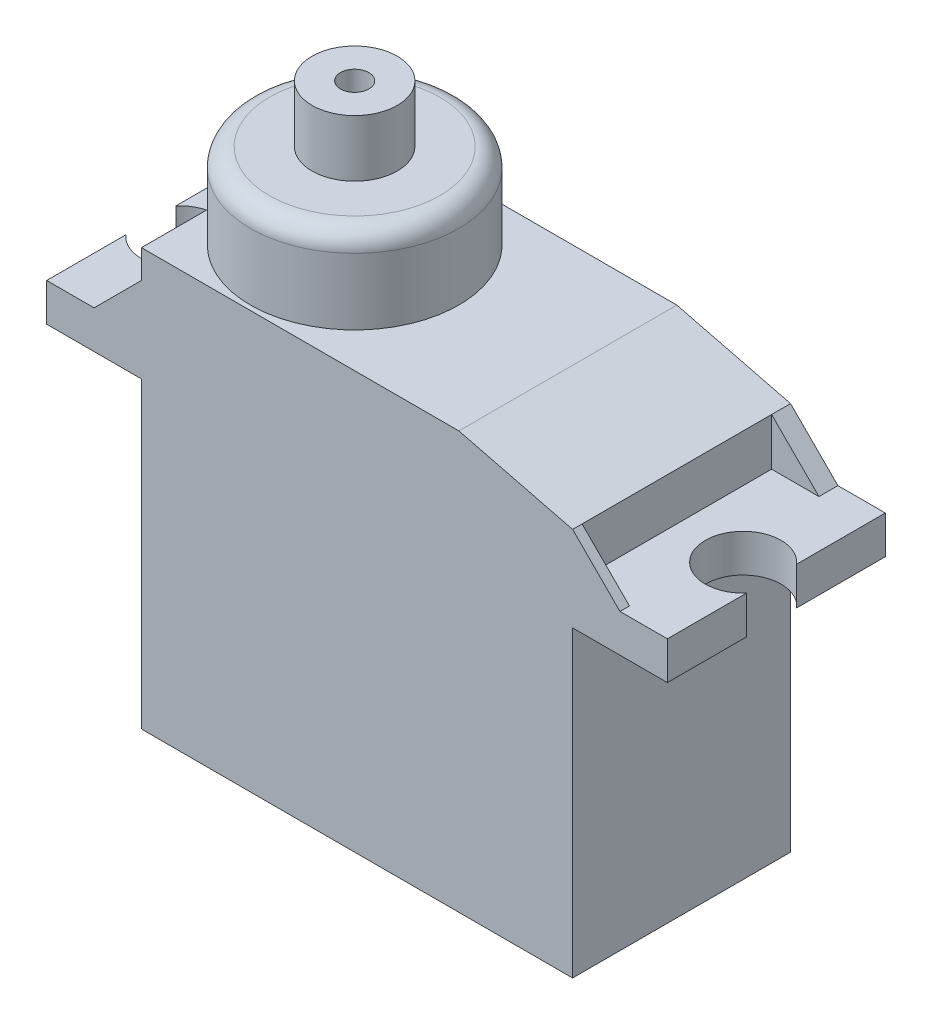
ISO-10303-21;
HEADER;
FILE_DESCRIPTION(('STEP AP214'),'2;1');
FILE_NAME('part.step','',(''),(''),'','','');
FILE_SCHEMA(('AUTOMOTIVE_DESIGN { 1 0 10303 214 1 1 1 1 }'));
ENDSEC;
DATA;
#1=APPLICATION_CONTEXT('core data for automotive mechanical design processes');
#2=APPLICATION_PROTOCOL_DEFINITION('international standard','automotive_design',2000,#1);
#3=PRODUCT_CONTEXT('',#1,'mechanical');
#4=PRODUCT('Part','Part','',(#3));
#5=PRODUCT_RELATED_PRODUCT_CATEGORY('part','',(#4));
#6=PRODUCT_DEFINITION_FORMATION('','',#4);
#7=PRODUCT_DEFINITION_CONTEXT('part definition',#1,'design');
#8=PRODUCT_DEFINITION('design','',#6,#7);
#9=PRODUCT_DEFINITION_SHAPE('','',#8);
#10=(LENGTH_UNIT() NAMED_UNIT(*) SI_UNIT(.MILLI.,.METRE.));
#11=(NAMED_UNIT(*) PLANE_ANGLE_UNIT() SI_UNIT($,.RADIAN.));
#12=(NAMED_UNIT(*) SI_UNIT($,.STERADIAN.) SOLID_ANGLE_UNIT());
#13=UNCERTAINTY_MEASURE_WITH_UNIT(LENGTH_MEASURE(1.E-05),#10,'distance_accuracy_value','');
#14=(GEOMETRIC_REPRESENTATION_CONTEXT(3) GLOBAL_UNCERTAINTY_ASSIGNED_CONTEXT((#13)) GLOBAL_UNIT_ASSIGNED_CONTEXT((#10,
#11,#12)) REPRESENTATION_CONTEXT('',''));
#15=CARTESIAN_POINT('',(0.,0.,0.));
#16=DIRECTION('',(0.,0.,1.));
#17=DIRECTION('',(1.,0.,0.));
#18=AXIS2_PLACEMENT_3D('',#15,#16,#17);
#19=CARTESIAN_POINT('',(-5.,18.,-11.5));
#20=DIRECTION('',(-1.,0.,0.));
#21=DIRECTION('',(0.,-1.,0.));
#22=AXIS2_PLACEMENT_3D('',#19,#20,#21);
#23=PLANE('',#22);
#24=DIRECTION('',(0.,1.,0.));
#25=VECTOR('',#24,1.);
#26=CARTESIAN_POINT('',(-4.99999999999999,-2.50000000048389E-05,-4.17712434446761));
#27=LINE('',#26,#25);
#28=CARTESIAN_POINT('',(-5.,16.,-4.17712434446764));
#29=VERTEX_POINT('',#28);
#30=CARTESIAN_POINT('',(-5.,18.,-4.17712434446765));
#31=VERTEX_POINT('',#30);
#32=EDGE_CURVE('E50',#29,#31,#27,.T.);
#33=ORIENTED_EDGE('',*,*,#32,.F.);
#34=DIRECTION('',(0.,0.,1.));
#35=VECTOR('',#34,1.);
#36=CARTESIAN_POINT('',(-5.,16.,-11.5));
#37=LINE('',#36,#35);
#38=CARTESIAN_POINT('',(-5.,16.,0.));
#39=VERTEX_POINT('',#38);
#40=EDGE_CURVE('E218',#29,#39,#37,.T.);
#41=ORIENTED_EDGE('',*,*,#40,.T.);
#42=DIRECTION('',(0.,-1.,0.));
#43=VECTOR('',#42,1.);
#44=CARTESIAN_POINT('',(-5.,18.,0.));
#45=LINE('',#44,#43);
#46=CARTESIAN_POINT('',(-5.,18.,0.));
#47=VERTEX_POINT('',#46);
#48=EDGE_CURVE('E261',#47,#39,#45,.T.);
#49=ORIENTED_EDGE('',*,*,#48,.F.);
#50=DIRECTION('',(0.,0.,1.));
#51=VECTOR('',#50,1.);
#52=CARTESIAN_POINT('',(-5.,18.,-11.5));
#53=LINE('',#52,#51);
#54=EDGE_CURVE('E219',#31,#47,#53,.T.);
#55=ORIENTED_EDGE('',*,*,#54,.F.);
#56=EDGE_LOOP('',(#33,#41,#49,#55));
#57=FACE_BOUND('',#56,.T.);
#58=ADVANCED_FACE('F35',(#57),#23,.T.);
#59=CARTESIAN_POINT('',(27.75,16.,-11.5));
#60=DIRECTION('',(1.,0.,0.));
#61=DIRECTION('',(0.,0.,-1.));
#62=AXIS2_PLACEMENT_3D('',#59,#60,#61);
#63=PLANE('',#62);
#64=DIRECTION('',(0.,1.,0.));
#65=VECTOR('',#64,1.);
#66=CARTESIAN_POINT('',(27.75,-2.50000000458217E-05,-6.82287565553227));
#67=LINE('',#66,#65);
#68=CARTESIAN_POINT('',(27.75,16.,-6.82287565553229));
#69=VERTEX_POINT('',#68);
#70=CARTESIAN_POINT('',(27.75,17.9999999999999,-6.8228756555323));
#71=VERTEX_POINT('',#70);
#72=EDGE_CURVE('E11',#69,#71,#67,.T.);
#73=ORIENTED_EDGE('',*,*,#72,.F.);
#74=DIRECTION('',(0.,0.,1.));
#75=VECTOR('',#74,1.);
#76=CARTESIAN_POINT('',(27.75,16.,-11.5));
#77=LINE('',#76,#75);
#78=CARTESIAN_POINT('',(27.75,16.,-11.5));
#79=VERTEX_POINT('',#78);
#80=EDGE_CURVE('E249',#79,#69,#77,.T.);
#81=ORIENTED_EDGE('',*,*,#80,.F.);
#82=DIRECTION('',(0.,1.,0.));
#83=VECTOR('',#82,1.);
#84=CARTESIAN_POINT('',(27.75,16.,-11.5));
#85=LINE('',#84,#83);
#86=CARTESIAN_POINT('',(27.75,18.,-11.5));
#87=VERTEX_POINT('',#86);
#88=EDGE_CURVE('E311',#79,#87,#85,.T.);
#89=ORIENTED_EDGE('',*,*,#88,.T.);
#90=DIRECTION('',(0.,0.,1.));
#91=VECTOR('',#90,1.);
#92=CARTESIAN_POINT('',(27.75,18.,-11.5));
#93=LINE('',#92,#91);
#94=EDGE_CURVE('E245',#87,#71,#93,.T.);
#95=ORIENTED_EDGE('',*,*,#94,.T.);
#96=EDGE_LOOP('',(#73,#81,#89,#95));
#97=FACE_BOUND('',#96,.T.);
#98=ADVANCED_FACE('F338',(#97),#63,.T.);
#99=CARTESIAN_POINT('',(25.25,18.,-11.5));
#100=DIRECTION('',(0.707106781186548,0.707106781186547,0.));
#101=DIRECTION('',(-0.707106781186547,0.707106781186548,0.));
#102=AXIS2_PLACEMENT_3D('',#99,#100,#101);
#103=PLANE('',#102);
#104=DIRECTION('',(0.,0.,1.));
#105=VECTOR('',#104,1.);
#106=CARTESIAN_POINT('',(22.75,20.5,-11.5));
#107=LINE('',#106,#105);
#108=CARTESIAN_POINT('',(22.75,20.5,-11.5));
#109=VERTEX_POINT('',#108);
#110=CARTESIAN_POINT('',(22.75,20.5,-10.5));
#111=VERTEX_POINT('',#110);
#112=EDGE_CURVE('E237',#109,#111,#107,.T.);
#113=ORIENTED_EDGE('',*,*,#112,.T.);
#114=DIRECTION('',(-0.707106781186547,0.707106781186548,0.));
#115=VECTOR('',#114,1.);
#116=CARTESIAN_POINT('',(25.25,18.,-10.5));
#117=LINE('',#116,#115);
#118=CARTESIAN_POINT('',(25.25,18.,-10.5));
#119=VERTEX_POINT('',#118);
#120=EDGE_CURVE('E355',#119,#111,#117,.T.);
#121=ORIENTED_EDGE('',*,*,#120,.F.);
#122=DIRECTION('',(0.,0.,1.));
#123=VECTOR('',#122,1.);
#124=CARTESIAN_POINT('',(25.25,18.,-11.5));
#125=LINE('',#124,#123);
#126=CARTESIAN_POINT('',(25.25,18.,-11.5));
#127=VERTEX_POINT('',#126);
#128=EDGE_CURVE('E241',#127,#119,#125,.T.);
#129=ORIENTED_EDGE('',*,*,#128,.F.);
#130=DIRECTION('',(-0.707106781186547,0.707106781186548,0.));
#131=VECTOR('',#130,1.);
#132=CARTESIAN_POINT('',(25.25,18.,-11.5));
#133=LINE('',#132,#131);
#134=EDGE_CURVE('E305',#127,#109,#133,.T.);
#135=ORIENTED_EDGE('',*,*,#134,.T.);
#136=EDGE_LOOP('',(#113,#121,#129,#135));
#137=FACE_BOUND('',#136,.T.);
#138=ADVANCED_FACE('F418',(#137),#103,.T.);
#139=CARTESIAN_POINT('',(0.,20.5,-11.5));
#140=DIRECTION('',(-0.707106781186546,0.707106781186549,0.));
#141=DIRECTION('',(-0.707106781186549,-0.707106781186546,0.));
#142=AXIS2_PLACEMENT_3D('',#139,#140,#141);
#143=PLANE('',#142);
#144=DIRECTION('',(0.,0.,1.));
#145=VECTOR('',#144,1.);
#146=CARTESIAN_POINT('',(-2.5,18.,-11.5));
#147=LINE('',#146,#145);
#148=CARTESIAN_POINT('',(-2.5,18.,-11.5));
#149=VERTEX_POINT('',#148);
#150=CARTESIAN_POINT('',(-2.5,18.,-10.5));
#151=VERTEX_POINT('',#150);
#152=EDGE_CURVE('E222',#149,#151,#147,.T.);
#153=ORIENTED_EDGE('',*,*,#152,.T.);
#154=DIRECTION('',(-0.707106781186549,-0.707106781186546,0.));
#155=VECTOR('',#154,1.);
#156=CARTESIAN_POINT('',(0.,20.5,-10.5));
#157=LINE('',#156,#155);
#158=CARTESIAN_POINT('',(0.,20.5,-10.5));
#159=VERTEX_POINT('',#158);
#160=EDGE_CURVE('E375',#159,#151,#157,.T.);
#161=ORIENTED_EDGE('',*,*,#160,.F.);
#162=DIRECTION('',(0.,0.,1.));
#163=VECTOR('',#162,1.);
#164=CARTESIAN_POINT('',(0.,20.5,-11.5));
#165=LINE('',#164,#163);
#166=CARTESIAN_POINT('',(0.,20.5,-11.5));
#167=VERTEX_POINT('',#166);
#168=EDGE_CURVE('E228',#167,#159,#165,.T.);
#169=ORIENTED_EDGE('',*,*,#168,.F.);
#170=DIRECTION('',(-0.707106781186549,-0.707106781186546,0.));
#171=VECTOR('',#170,1.);
#172=CARTESIAN_POINT('',(0.,20.5,-11.5));
#173=LINE('',#172,#171);
#174=EDGE_CURVE('E293',#167,#149,#173,.T.);
#175=ORIENTED_EDGE('',*,*,#174,.T.);
#176=EDGE_LOOP('',(#153,#161,#169,#175));
#177=FACE_BOUND('',#176,.T.);
#178=ADVANCED_FACE('F409',(#177),#143,.T.);
#179=CARTESIAN_POINT('',(5.5,26.5,-5.75));
#180=DIRECTION('',(0.,1.,0.));
#181=DIRECTION('',(-1.,0.,0.));
#182=AXIS2_PLACEMENT_3D('',#179,#180,#181);
#183=PLANE('',#182);
#184=CARTESIAN_POINT('',(5.5,26.5,-5.75));
#185=DIRECTION('',(0.,1.,0.));
#186=DIRECTION('',(-1.,0.,0.));
#187=AXIS2_PLACEMENT_3D('',#184,#185,#186);
#188=CIRCLE('',#187,4.5);
#189=CARTESIAN_POINT('',(0.999999999999997,26.5,-5.75));
#190=VERTEX_POINT('',#189);
#191=EDGE_CURVE('E496',#190,#190,#188,.T.);
#192=ORIENTED_EDGE('',*,*,#191,.T.);
#193=EDGE_LOOP('',(#192));
#194=FACE_BOUND('',#193,.T.);
#195=CARTESIAN_POINT('',(5.5,26.5,-5.75));
#196=DIRECTION('',(0.,1.,0.));
#197=DIRECTION('',(-1.,0.,0.));
#198=AXIS2_PLACEMENT_3D('',#195,#196,#197);
#199=CIRCLE('',#198,2.25);
#200=CARTESIAN_POINT('',(3.25,26.5,-5.75));
#201=VERTEX_POINT('',#200);
#202=EDGE_CURVE('E396',#201,#201,#199,.T.);
#203=ORIENTED_EDGE('',*,*,#202,.F.);
#204=EDGE_LOOP('',(#203));
#205=FACE_BOUND('',#204,.T.);
#206=ADVANCED_FACE('F406',(#194,#205),#183,.T.);
#207=CARTESIAN_POINT('',(0.,16.,0.));
#208=DIRECTION('',(1.,0.,0.));
#209=DIRECTION('',(0.,0.,-1.));
#210=AXIS2_PLACEMENT_3D('',#207,#208,#209);
#211=PLANE('',#210);
#212=DIRECTION('',(0.,0.,1.));
#213=VECTOR('',#212,1.);
#214=CARTESIAN_POINT('',(0.,0.,0.));
#215=LINE('',#214,#213);
#216=CARTESIAN_POINT('',(0.,0.,-11.5));
#217=VERTEX_POINT('',#216);
#218=CARTESIAN_POINT('',(0.,0.,0.));
#219=VERTEX_POINT('',#218);
#220=EDGE_CURVE('E521',#217,#219,#215,.T.);
#221=ORIENTED_EDGE('',*,*,#220,.T.);
#222=DIRECTION('',(0.,-1.,0.));
#223=VECTOR('',#222,1.);
#224=CARTESIAN_POINT('',(0.,16.,0.));
#225=LINE('',#224,#223);
#226=CARTESIAN_POINT('',(0.,16.,0.));
#227=VERTEX_POINT('',#226);
#228=EDGE_CURVE('E500',#227,#219,#225,.T.);
#229=ORIENTED_EDGE('',*,*,#228,.F.);
#230=DIRECTION('',(0.,0.,1.));
#231=VECTOR('',#230,1.);
#232=CARTESIAN_POINT('',(0.,16.,0.));
#233=LINE('',#232,#231);
#234=CARTESIAN_POINT('',(0.,16.,-11.5));
#235=VERTEX_POINT('',#234);
#236=EDGE_CURVE('E512',#235,#227,#233,.T.);
#237=ORIENTED_EDGE('',*,*,#236,.F.);
#238=DIRECTION('',(0.,-1.,0.));
#239=VECTOR('',#238,1.);
#240=CARTESIAN_POINT('',(0.,16.,-11.5));
#241=LINE('',#240,#239);
#242=EDGE_CURVE('E503',#235,#217,#241,.T.);
#243=ORIENTED_EDGE('',*,*,#242,.T.);
#244=EDGE_LOOP('',(#221,#229,#237,#243));
#245=FACE_BOUND('',#244,.T.);
#246=ADVANCED_FACE('F408',(#245),#211,.F.);
#247=CARTESIAN_POINT('',(0.,16.,0.));
#248=DIRECTION('',(0.,0.,-1.));
#249=DIRECTION('',(-1.,0.,0.));
#250=AXIS2_PLACEMENT_3D('',#247,#248,#249);
#251=PLANE('',#250);
#252=DIRECTION('',(1.,0.,0.));
#253=VECTOR('',#252,1.);
#254=CARTESIAN_POINT('',(0.,0.,0.));
#255=LINE('',#254,#253);
#256=CARTESIAN_POINT('',(22.75,0.,0.));
#257=VERTEX_POINT('',#256);
#258=EDGE_CURVE('E534',#219,#257,#255,.T.);
#259=ORIENTED_EDGE('',*,*,#258,.T.);
#260=DIRECTION('',(0.,-1.,0.));
#261=VECTOR('',#260,1.);
#262=CARTESIAN_POINT('',(22.75,16.,0.));
#263=LINE('',#262,#261);
#264=CARTESIAN_POINT('',(22.75,16.,0.));
#265=VERTEX_POINT('',#264);
#266=EDGE_CURVE('E511',#265,#257,#263,.T.);
#267=ORIENTED_EDGE('',*,*,#266,.F.);
#268=DIRECTION('',(1.,0.,0.));
#269=VECTOR('',#268,1.);
#270=CARTESIAN_POINT('',(-5.,16.,0.));
#271=LINE('',#270,#269);
#272=CARTESIAN_POINT('',(27.75,16.,0.));
#273=VERTEX_POINT('',#272);
#274=EDGE_CURVE('E257',#265,#273,#271,.T.);
#275=ORIENTED_EDGE('',*,*,#274,.T.);
#276=DIRECTION('',(0.,1.,0.));
#277=VECTOR('',#276,1.);
#278=CARTESIAN_POINT('',(27.75,16.,0.));
#279=LINE('',#278,#277);
#280=CARTESIAN_POINT('',(27.75,18.,0.));
#281=VERTEX_POINT('',#280);
#282=EDGE_CURVE('E286',#273,#281,#279,.T.);
#283=ORIENTED_EDGE('',*,*,#282,.T.);
#284=DIRECTION('',(-1.,0.,0.));
#285=VECTOR('',#284,1.);
#286=CARTESIAN_POINT('',(27.75,18.,0.));
#287=LINE('',#286,#285);
#288=CARTESIAN_POINT('',(25.25,18.,0.));
#289=VERTEX_POINT('',#288);
#290=EDGE_CURVE('E283',#281,#289,#287,.T.);
#291=ORIENTED_EDGE('',*,*,#290,.T.);
#292=DIRECTION('',(-0.707106781186547,0.707106781186548,0.));
#293=VECTOR('',#292,1.);
#294=CARTESIAN_POINT('',(25.25,18.,0.));
#295=LINE('',#294,#293);
#296=CARTESIAN_POINT('',(22.75,20.5,0.));
#297=VERTEX_POINT('',#296);
#298=EDGE_CURVE('E280',#289,#297,#295,.T.);
#299=ORIENTED_EDGE('',*,*,#298,.T.);
#300=DIRECTION('',(-0.970142500145332,0.242535625036333,0.));
#301=VECTOR('',#300,1.);
#302=CARTESIAN_POINT('',(22.75,20.5,0.));
#303=LINE('',#302,#301);
#304=CARTESIAN_POINT('',(16.75,22.,0.));
#305=VERTEX_POINT('',#304);
#306=EDGE_CURVE('E277',#297,#305,#303,.T.);
#307=ORIENTED_EDGE('',*,*,#306,.T.);
#308=DIRECTION('',(-1.,0.,0.));
#309=VECTOR('',#308,1.);
#310=CARTESIAN_POINT('',(16.75,22.,0.));
#311=LINE('',#310,#309);
#312=CARTESIAN_POINT('',(0.,22.,0.));
#313=VERTEX_POINT('',#312);
#314=EDGE_CURVE('E274',#305,#313,#311,.T.);
#315=ORIENTED_EDGE('',*,*,#314,.T.);
#316=DIRECTION('',(0.,-1.,0.));
#317=VECTOR('',#316,1.);
#318=CARTESIAN_POINT('',(0.,22.,0.));
#319=LINE('',#318,#317);
#320=CARTESIAN_POINT('',(0.,20.5,0.));
#321=VERTEX_POINT('',#320);
#322=EDGE_CURVE('E271',#313,#321,#319,.T.);
#323=ORIENTED_EDGE('',*,*,#322,.T.);
#324=DIRECTION('',(-0.707106781186549,-0.707106781186546,0.));
#325=VECTOR('',#324,1.);
#326=CARTESIAN_POINT('',(0.,20.5,0.));
#327=LINE('',#326,#325);
#328=CARTESIAN_POINT('',(-2.5,18.,0.));
#329=VERTEX_POINT('',#328);
#330=EDGE_CURVE('E268',#321,#329,#327,.T.);
#331=ORIENTED_EDGE('',*,*,#330,.T.);
#332=DIRECTION('',(-1.,0.,0.));
#333=VECTOR('',#332,1.);
#334=CARTESIAN_POINT('',(-2.5,18.,0.));
#335=LINE('',#334,#333);
#336=EDGE_CURVE('E265',#329,#47,#335,.T.);
#337=ORIENTED_EDGE('',*,*,#336,.T.);
#338=ORIENTED_EDGE('',*,*,#48,.T.);
#339=EDGE_CURVE('E253',#39,#227,#271,.T.);
#340=ORIENTED_EDGE('',*,*,#339,.T.);
#341=ORIENTED_EDGE('',*,*,#228,.T.);
#342=EDGE_LOOP('',(#259,#267,#275,#283,#291,#299,#307,#315,#323,#331,#337,#338,#340,#341));
#343=FACE_BOUND('',#342,.T.);
#344=ADVANCED_FACE('F416',(#343),#251,.F.);
#345=CARTESIAN_POINT('',(22.75,16.,0.));
#346=DIRECTION('',(-1.,0.,0.));
#347=DIRECTION('',(0.,0.,1.));
#348=AXIS2_PLACEMENT_3D('',#345,#346,#347);
#349=PLANE('',#348);
#350=DIRECTION('',(0.,0.,-1.));
#351=VECTOR('',#350,1.);
#352=CARTESIAN_POINT('',(22.75,0.,0.));
#353=LINE('',#352,#351);
#354=CARTESIAN_POINT('',(22.75,0.,-11.5));
#355=VERTEX_POINT('',#354);
#356=EDGE_CURVE('E533',#257,#355,#353,.T.);
#357=ORIENTED_EDGE('',*,*,#356,.T.);
#358=DIRECTION('',(0.,-1.,0.));
#359=VECTOR('',#358,1.);
#360=CARTESIAN_POINT('',(22.75,16.,-11.5));
#361=LINE('',#360,#359);
#362=CARTESIAN_POINT('',(22.75,16.,-11.5));
#363=VERTEX_POINT('',#362);
#364=EDGE_CURVE('E506',#363,#355,#361,.T.);
#365=ORIENTED_EDGE('',*,*,#364,.F.);
#366=DIRECTION('',(0.,0.,-1.));
#367=VECTOR('',#366,1.);
#368=CARTESIAN_POINT('',(22.75,16.,0.));
#369=LINE('',#368,#367);
#370=EDGE_CURVE('E332',#265,#363,#369,.T.);
#371=ORIENTED_EDGE('',*,*,#370,.F.);
#372=ORIENTED_EDGE('',*,*,#266,.T.);
#373=EDGE_LOOP('',(#357,#365,#371,#372));
#374=FACE_BOUND('',#373,.T.);
#375=ADVANCED_FACE('F782',(#374),#349,.F.);
#376=CARTESIAN_POINT('',(0.,16.,-11.5));
#377=DIRECTION('',(0.,0.,1.));
#378=DIRECTION('',(1.,0.,0.));
#379=AXIS2_PLACEMENT_3D('',#376,#377,#378);
#380=PLANE('',#379);
#381=DIRECTION('',(-1.,0.,0.));
#382=VECTOR('',#381,1.);
#383=CARTESIAN_POINT('',(0.,0.,-11.5));
#384=LINE('',#383,#382);
#385=EDGE_CURVE('E514',#355,#217,#384,.T.);
#386=ORIENTED_EDGE('',*,*,#385,.T.);
#387=ORIENTED_EDGE('',*,*,#242,.F.);
#388=DIRECTION('',(1.,0.,0.));
#389=VECTOR('',#388,1.);
#390=CARTESIAN_POINT('',(0.,16.,-11.5));
#391=LINE('',#390,#389);
#392=CARTESIAN_POINT('',(-5.,16.,-11.5));
#393=VERTEX_POINT('',#392);
#394=EDGE_CURVE('E314',#393,#235,#391,.T.);
#395=ORIENTED_EDGE('',*,*,#394,.F.);
#396=DIRECTION('',(0.,-1.,0.));
#397=VECTOR('',#396,1.);
#398=CARTESIAN_POINT('',(-5.,18.,-11.5));
#399=LINE('',#398,#397);
#400=CARTESIAN_POINT('',(-5.,18.,-11.5));
#401=VERTEX_POINT('',#400);
#402=EDGE_CURVE('E290',#401,#393,#399,.T.);
#403=ORIENTED_EDGE('',*,*,#402,.F.);
#404=DIRECTION('',(-1.,0.,0.));
#405=VECTOR('',#404,1.);
#406=CARTESIAN_POINT('',(-2.5,18.,-11.5));
#407=LINE('',#406,#405);
#408=EDGE_CURVE('E217',#149,#401,#407,.T.);
#409=ORIENTED_EDGE('',*,*,#408,.F.);
#410=ORIENTED_EDGE('',*,*,#174,.F.);
#411=DIRECTION('',(0.,-1.,0.));
#412=VECTOR('',#411,1.);
#413=CARTESIAN_POINT('',(0.,22.,-11.5));
#414=LINE('',#413,#412);
#415=CARTESIAN_POINT('',(0.,22.,-11.5));
#416=VERTEX_POINT('',#415);
#417=EDGE_CURVE('E296',#416,#167,#414,.T.);
#418=ORIENTED_EDGE('',*,*,#417,.F.);
#419=DIRECTION('',(-1.,0.,0.));
#420=VECTOR('',#419,1.);
#421=CARTESIAN_POINT('',(16.75,22.,-11.5));
#422=LINE('',#421,#420);
#423=CARTESIAN_POINT('',(16.75,22.,-11.5));
#424=VERTEX_POINT('',#423);
#425=EDGE_CURVE('E299',#424,#416,#422,.T.);
#426=ORIENTED_EDGE('',*,*,#425,.F.);
#427=DIRECTION('',(-0.970142500145332,0.242535625036333,0.));
#428=VECTOR('',#427,1.);
#429=CARTESIAN_POINT('',(22.75,20.5,-11.5));
#430=LINE('',#429,#428);
#431=EDGE_CURVE('E302',#109,#424,#430,.T.);
#432=ORIENTED_EDGE('',*,*,#431,.F.);
#433=ORIENTED_EDGE('',*,*,#134,.F.);
#434=DIRECTION('',(-1.,0.,0.));
#435=VECTOR('',#434,1.);
#436=CARTESIAN_POINT('',(27.75,18.,-11.5));
#437=LINE('',#436,#435);
#438=EDGE_CURVE('E308',#87,#127,#437,.T.);
#439=ORIENTED_EDGE('',*,*,#438,.F.);
#440=ORIENTED_EDGE('',*,*,#88,.F.);
#441=EDGE_CURVE('E256',#363,#79,#391,.T.);
#442=ORIENTED_EDGE('',*,*,#441,.F.);
#443=ORIENTED_EDGE('',*,*,#364,.T.);
#444=EDGE_LOOP('',(#386,#387,#395,#403,#409,#410,#418,#426,#432,#433,#439,#440,#442,#443));
#445=FACE_BOUND('',#444,.T.);
#446=ADVANCED_FACE('F340',(#445),#380,.F.);
#447=CARTESIAN_POINT('',(0.,0.,-11.5));
#448=DIRECTION('',(0.,-1.,0.));
#449=DIRECTION('',(0.,0.,-1.));
#450=AXIS2_PLACEMENT_3D('',#447,#448,#449);
#451=PLANE('',#450);
#452=ORIENTED_EDGE('',*,*,#220,.F.);
#453=ORIENTED_EDGE('',*,*,#385,.F.);
#454=ORIENTED_EDGE('',*,*,#356,.F.);
#455=ORIENTED_EDGE('',*,*,#258,.F.);
#456=EDGE_LOOP('',(#452,#453,#454,#455));
#457=FACE_BOUND('',#456,.T.);
#458=ADVANCED_FACE('F444',(#457),#451,.T.);
#459=CARTESIAN_POINT('',(-5.,16.,-11.5));
#460=DIRECTION('',(0.,-1.,0.));
#461=DIRECTION('',(0.,0.,-1.));
#462=AXIS2_PLACEMENT_3D('',#459,#460,#461);
#463=PLANE('',#462);
#464=CARTESIAN_POINT('',(-3.50000000000005,16.,-5.5));
#465=DIRECTION('',(0.,-1.,0.));
#466=DIRECTION('',(0.,0.,-1.));
#467=AXIS2_PLACEMENT_3D('',#464,#465,#466);
#468=CIRCLE('',#467,2.);
#469=CARTESIAN_POINT('',(-4.99999999999997,16.,-6.82287565553239));
#470=VERTEX_POINT('',#469);
#471=EDGE_CURVE('E212',#470,#29,#468,.T.);
#472=ORIENTED_EDGE('',*,*,#471,.F.);
#473=EDGE_CURVE('E211',#393,#470,#37,.T.);
#474=ORIENTED_EDGE('',*,*,#473,.F.);
#475=ORIENTED_EDGE('',*,*,#394,.T.);
#476=ORIENTED_EDGE('',*,*,#236,.T.);
#477=ORIENTED_EDGE('',*,*,#339,.F.);
#478=ORIENTED_EDGE('',*,*,#40,.F.);
#479=EDGE_LOOP('',(#472,#474,#475,#476,#477,#478));
#480=FACE_BOUND('',#479,.T.);
#481=ADVANCED_FACE('F440',(#480),#463,.T.);
#482=CARTESIAN_POINT('',(26.25,16.,-5.5));
#483=DIRECTION('',(0.,-1.,0.));
#484=DIRECTION('',(0.,0.,-1.));
#485=AXIS2_PLACEMENT_3D('',#482,#483,#484);
#486=CIRCLE('',#485,2.);
#487=CARTESIAN_POINT('',(27.75,16.,-4.17712434446773));
#488=VERTEX_POINT('',#487);
#489=EDGE_CURVE('E348',#488,#69,#486,.T.);
#490=ORIENTED_EDGE('',*,*,#489,.F.);
#491=EDGE_CURVE('E252',#488,#273,#77,.T.);
#492=ORIENTED_EDGE('',*,*,#491,.T.);
#493=ORIENTED_EDGE('',*,*,#274,.F.);
#494=ORIENTED_EDGE('',*,*,#370,.T.);
#495=ORIENTED_EDGE('',*,*,#441,.T.);
#496=ORIENTED_EDGE('',*,*,#80,.T.);
#497=EDGE_LOOP('',(#490,#492,#493,#494,#495,#496));
#498=FACE_BOUND('',#497,.T.);
#499=ADVANCED_FACE('F329',(#498),#463,.T.);
#500=DIRECTION('',(0.,1.,0.));
#501=VECTOR('',#500,1.);
#502=CARTESIAN_POINT('',(-4.99999999999999,-2.50000000048389E-05,-6.82287565553239));
#503=LINE('',#502,#501);
#504=CARTESIAN_POINT('',(-5.,18.,-6.82287565553235));
#505=VERTEX_POINT('',#504);
#506=EDGE_CURVE('E198',#505,#470,#503,.F.);
#507=ORIENTED_EDGE('',*,*,#506,.F.);
#508=EDGE_CURVE('E208',#401,#505,#53,.T.);
#509=ORIENTED_EDGE('',*,*,#508,.F.);
#510=ORIENTED_EDGE('',*,*,#402,.T.);
#511=ORIENTED_EDGE('',*,*,#473,.T.);
#512=EDGE_LOOP('',(#507,#509,#510,#511));
#513=FACE_BOUND('',#512,.T.);
#514=ADVANCED_FACE('F206',(#513),#23,.T.);
#515=CARTESIAN_POINT('',(-2.5,18.,-11.5));
#516=DIRECTION('',(0.,1.,0.));
#517=DIRECTION('',(0.,0.,1.));
#518=AXIS2_PLACEMENT_3D('',#515,#516,#517);
#519=PLANE('',#518);
#520=CARTESIAN_POINT('',(-3.50000000000005,18.,-5.5));
#521=DIRECTION('',(0.,1.,0.));
#522=DIRECTION('',(-1.,0.,0.));
#523=AXIS2_PLACEMENT_3D('',#520,#521,#522);
#524=CIRCLE('',#523,2.);
#525=EDGE_CURVE('E195',#31,#505,#524,.T.);
#526=ORIENTED_EDGE('',*,*,#525,.F.);
#527=ORIENTED_EDGE('',*,*,#54,.T.);
#528=ORIENTED_EDGE('',*,*,#336,.F.);
#529=CARTESIAN_POINT('',(-2.5,18.,-0.5));
#530=VERTEX_POINT('',#529);
#531=EDGE_CURVE('E227',#530,#329,#147,.T.);
#532=ORIENTED_EDGE('',*,*,#531,.F.);
#533=DIRECTION('',(1.,0.,0.));
#534=VECTOR('',#533,1.);
#535=CARTESIAN_POINT('',(-2.5,18.,-0.5));
#536=LINE('',#535,#534);
#537=CARTESIAN_POINT('',(0.,18.,-0.5));
#538=VERTEX_POINT('',#537);
#539=EDGE_CURVE('E387',#530,#538,#536,.T.);
#540=ORIENTED_EDGE('',*,*,#539,.T.);
#541=DIRECTION('',(0.,0.,1.));
#542=VECTOR('',#541,1.);
#543=CARTESIAN_POINT('',(0.,18.,-10.5));
#544=LINE('',#543,#542);
#545=CARTESIAN_POINT('',(0.,18.,-10.5));
#546=VERTEX_POINT('',#545);
#547=EDGE_CURVE('E384',#546,#538,#544,.T.);
#548=ORIENTED_EDGE('',*,*,#547,.F.);
#549=DIRECTION('',(1.,0.,0.));
#550=VECTOR('',#549,1.);
#551=CARTESIAN_POINT('',(-2.5,18.,-10.5));
#552=LINE('',#551,#550);
#553=EDGE_CURVE('E378',#151,#546,#552,.T.);
#554=ORIENTED_EDGE('',*,*,#553,.F.);
#555=ORIENTED_EDGE('',*,*,#152,.F.);
#556=ORIENTED_EDGE('',*,*,#408,.T.);
#557=ORIENTED_EDGE('',*,*,#508,.T.);
#558=EDGE_LOOP('',(#526,#527,#528,#532,#540,#548,#554,#555,#556,#557));
#559=FACE_BOUND('',#558,.T.);
#560=ADVANCED_FACE('F215',(#559),#519,.T.);
#561=DIRECTION('',(-0.707106781186549,-0.707106781186546,0.));
#562=VECTOR('',#561,1.);
#563=CARTESIAN_POINT('',(0.,20.5,-0.5));
#564=LINE('',#563,#562);
#565=CARTESIAN_POINT('',(0.,20.5,-0.5));
#566=VERTEX_POINT('',#565);
#567=EDGE_CURVE('E373',#566,#530,#564,.T.);
#568=ORIENTED_EDGE('',*,*,#567,.T.);
#569=ORIENTED_EDGE('',*,*,#531,.T.);
#570=ORIENTED_EDGE('',*,*,#330,.F.);
#571=EDGE_CURVE('E231',#566,#321,#165,.T.);
#572=ORIENTED_EDGE('',*,*,#571,.F.);
#573=EDGE_LOOP('',(#568,#569,#570,#572));
#574=FACE_BOUND('',#573,.T.);
#575=ADVANCED_FACE('F421',(#574),#143,.T.);
#576=CARTESIAN_POINT('',(0.,22.,-11.5));
#577=DIRECTION('',(-1.,0.,0.));
#578=DIRECTION('',(0.,-1.,0.));
#579=AXIS2_PLACEMENT_3D('',#576,#577,#578);
#580=PLANE('',#579);
#581=ORIENTED_EDGE('',*,*,#322,.F.);
#582=DIRECTION('',(0.,0.,1.));
#583=VECTOR('',#582,1.);
#584=CARTESIAN_POINT('',(0.,22.,-11.5));
#585=LINE('',#584,#583);
#586=CARTESIAN_POINT('',(0.,22.,-5.75));
#587=VERTEX_POINT('',#586);
#588=EDGE_CURVE('E234',#587,#313,#585,.T.);
#589=ORIENTED_EDGE('',*,*,#588,.F.);
#590=EDGE_CURVE('E232',#416,#587,#585,.T.);
#591=ORIENTED_EDGE('',*,*,#590,.F.);
#592=ORIENTED_EDGE('',*,*,#417,.T.);
#593=ORIENTED_EDGE('',*,*,#168,.T.);
#594=DIRECTION('',(0.,1.,0.));
#595=VECTOR('',#594,1.);
#596=CARTESIAN_POINT('',(0.,18.,-10.5));
#597=LINE('',#596,#595);
#598=EDGE_CURVE('E382',#546,#159,#597,.T.);
#599=ORIENTED_EDGE('',*,*,#598,.F.);
#600=ORIENTED_EDGE('',*,*,#547,.T.);
#601=DIRECTION('',(0.,1.,0.));
#602=VECTOR('',#601,1.);
#603=CARTESIAN_POINT('',(0.,18.,-0.5));
#604=LINE('',#603,#602);
#605=EDGE_CURVE('E379',#538,#566,#604,.T.);
#606=ORIENTED_EDGE('',*,*,#605,.T.);
#607=ORIENTED_EDGE('',*,*,#571,.T.);
#608=EDGE_LOOP('',(#581,#589,#591,#592,#593,#599,#600,#606,#607));
#609=FACE_BOUND('',#608,.T.);
#610=ADVANCED_FACE('F468',(#609),#580,.T.);
#611=CARTESIAN_POINT('',(16.75,22.,-11.5));
#612=DIRECTION('',(0.,1.,0.));
#613=DIRECTION('',(-1.,0.,0.));
#614=AXIS2_PLACEMENT_3D('',#611,#612,#613);
#615=PLANE('',#614);
#616=ORIENTED_EDGE('',*,*,#590,.T.);
#617=CARTESIAN_POINT('',(5.5,22.,-5.75));
#618=DIRECTION('',(0.,1.,0.));
#619=DIRECTION('',(-1.,0.,0.));
#620=AXIS2_PLACEMENT_3D('',#617,#618,#619);
#621=CIRCLE('',#620,5.5);
#622=EDGE_CURVE('E289',#587,#587,#621,.T.);
#623=ORIENTED_EDGE('',*,*,#622,.F.);
#624=ORIENTED_EDGE('',*,*,#588,.T.);
#625=ORIENTED_EDGE('',*,*,#314,.F.);
#626=DIRECTION('',(0.,0.,1.));
#627=VECTOR('',#626,1.);
#628=CARTESIAN_POINT('',(16.75,22.,-11.5));
#629=LINE('',#628,#627);
#630=EDGE_CURVE('E235',#424,#305,#629,.T.);
#631=ORIENTED_EDGE('',*,*,#630,.F.);
#632=ORIENTED_EDGE('',*,*,#425,.T.);
#633=EDGE_LOOP('',(#616,#623,#624,#625,#631,#632));
#634=FACE_BOUND('',#633,.T.);
#635=ADVANCED_FACE('F461',(#634),#615,.T.);
#636=CARTESIAN_POINT('',(22.75,20.5,-11.5));
#637=DIRECTION('',(0.242535625036333,0.970142500145332,0.));
#638=DIRECTION('',(-0.970142500145332,0.242535625036333,0.));
#639=AXIS2_PLACEMENT_3D('',#636,#637,#638);
#640=PLANE('',#639);
#641=ORIENTED_EDGE('',*,*,#306,.F.);
#642=CARTESIAN_POINT('',(22.75,20.5,-0.5));
#643=VERTEX_POINT('',#642);
#644=EDGE_CURVE('E240',#643,#297,#107,.T.);
#645=ORIENTED_EDGE('',*,*,#644,.F.);
#646=DIRECTION('',(0.,0.,1.));
#647=VECTOR('',#646,1.);
#648=CARTESIAN_POINT('',(22.75,20.5,-10.5));
#649=LINE('',#648,#647);
#650=EDGE_CURVE('E364',#111,#643,#649,.T.);
#651=ORIENTED_EDGE('',*,*,#650,.F.);
#652=ORIENTED_EDGE('',*,*,#112,.F.);
#653=ORIENTED_EDGE('',*,*,#431,.T.);
#654=ORIENTED_EDGE('',*,*,#630,.T.);
#655=EDGE_LOOP('',(#641,#645,#651,#652,#653,#654));
#656=FACE_BOUND('',#655,.T.);
#657=ADVANCED_FACE('F475',(#656),#640,.T.);
#658=DIRECTION('',(-0.707106781186547,0.707106781186548,0.));
#659=VECTOR('',#658,1.);
#660=CARTESIAN_POINT('',(25.25,18.,-0.5));
#661=LINE('',#660,#659);
#662=CARTESIAN_POINT('',(25.25,18.,-0.5));
#663=VERTEX_POINT('',#662);
#664=EDGE_CURVE('E350',#663,#643,#661,.T.);
#665=ORIENTED_EDGE('',*,*,#664,.T.);
#666=ORIENTED_EDGE('',*,*,#644,.T.);
#667=ORIENTED_EDGE('',*,*,#298,.F.);
#668=EDGE_CURVE('E244',#663,#289,#125,.T.);
#669=ORIENTED_EDGE('',*,*,#668,.F.);
#670=EDGE_LOOP('',(#665,#666,#667,#669));
#671=FACE_BOUND('',#670,.T.);
#672=ADVANCED_FACE('F492',(#671),#103,.T.);
#673=CARTESIAN_POINT('',(27.75,18.,-11.5));
#674=DIRECTION('',(0.,1.,0.));
#675=DIRECTION('',(-1.,0.,0.));
#676=AXIS2_PLACEMENT_3D('',#673,#674,#675);
#677=PLANE('',#676);
#678=CARTESIAN_POINT('',(26.25,17.9999999999999,-5.5));
#679=DIRECTION('',(0.,1.,0.));
#680=DIRECTION('',(-1.,0.,0.));
#681=AXIS2_PLACEMENT_3D('',#678,#679,#680);
#682=CIRCLE('',#681,2.);
#683=CARTESIAN_POINT('',(27.75,18.,-4.1771243444677));
#684=VERTEX_POINT('',#683);
#685=EDGE_CURVE('E57',#71,#684,#682,.T.);
#686=ORIENTED_EDGE('',*,*,#685,.F.);
#687=ORIENTED_EDGE('',*,*,#94,.F.);
#688=ORIENTED_EDGE('',*,*,#438,.T.);
#689=ORIENTED_EDGE('',*,*,#128,.T.);
#690=DIRECTION('',(1.,0.,0.));
#691=VECTOR('',#690,1.);
#692=CARTESIAN_POINT('',(22.75,18.,-10.5));
#693=LINE('',#692,#691);
#694=CARTESIAN_POINT('',(22.75,18.,-10.5));
#695=VERTEX_POINT('',#694);
#696=EDGE_CURVE('E362',#695,#119,#693,.T.);
#697=ORIENTED_EDGE('',*,*,#696,.F.);
#698=DIRECTION('',(0.,0.,1.));
#699=VECTOR('',#698,1.);
#700=CARTESIAN_POINT('',(22.75,18.,-10.5));
#701=LINE('',#700,#699);
#702=CARTESIAN_POINT('',(22.75,18.,-0.5));
#703=VERTEX_POINT('',#702);
#704=EDGE_CURVE('E371',#695,#703,#701,.T.);
#705=ORIENTED_EDGE('',*,*,#704,.T.);
#706=DIRECTION('',(1.,0.,0.));
#707=VECTOR('',#706,1.);
#708=CARTESIAN_POINT('',(22.75,18.,-0.5));
#709=LINE('',#708,#707);
#710=EDGE_CURVE('E359',#703,#663,#709,.T.);
#711=ORIENTED_EDGE('',*,*,#710,.T.);
#712=ORIENTED_EDGE('',*,*,#668,.T.);
#713=ORIENTED_EDGE('',*,*,#290,.F.);
#714=EDGE_CURVE('E248',#684,#281,#93,.T.);
#715=ORIENTED_EDGE('',*,*,#714,.F.);
#716=EDGE_LOOP('',(#686,#687,#688,#689,#697,#705,#711,#712,#713,#715));
#717=FACE_BOUND('',#716,.T.);
#718=ADVANCED_FACE('F344',(#717),#677,.T.);
#719=DIRECTION('',(0.,1.,0.));
#720=VECTOR('',#719,1.);
#721=CARTESIAN_POINT('',(27.75,-2.50000000458217E-05,-4.17712434446773));
#722=LINE('',#721,#720);
#723=EDGE_CURVE('E43',#684,#488,#722,.F.);
#724=ORIENTED_EDGE('',*,*,#723,.F.);
#725=ORIENTED_EDGE('',*,*,#714,.T.);
#726=ORIENTED_EDGE('',*,*,#282,.F.);
#727=ORIENTED_EDGE('',*,*,#491,.F.);
#728=EDGE_LOOP('',(#724,#725,#726,#727));
#729=FACE_BOUND('',#728,.T.);
#730=ADVANCED_FACE('F432',(#729),#63,.T.);
#731=CARTESIAN_POINT('',(5.5,26.5,-5.75));
#732=DIRECTION('',(0.,-1.,0.));
#733=DIRECTION('',(1.,0.,0.));
#734=AXIS2_PLACEMENT_3D('',#731,#732,#733);
#735=CYLINDRICAL_SURFACE('',#734,5.5);
#736=CARTESIAN_POINT('',(5.5,25.5,-5.75));
#737=DIRECTION('',(0.,1.,0.));
#738=DIRECTION('',(-1.,0.,0.));
#739=AXIS2_PLACEMENT_3D('',#736,#737,#738);
#740=CIRCLE('',#739,5.5);
#741=CARTESIAN_POINT('',(0.,25.5,-5.75));
#742=VERTEX_POINT('',#741);
#743=EDGE_CURVE('E457',#742,#742,#740,.F.);
#744=ORIENTED_EDGE('',*,*,#743,.T.);
#745=EDGE_LOOP('',(#744));
#746=FACE_BOUND('',#745,.T.);
#747=ORIENTED_EDGE('',*,*,#622,.T.);
#748=EDGE_LOOP('',(#747));
#749=FACE_BOUND('',#748,.T.);
#750=ADVANCED_FACE('F445',(#746,#749),#735,.T.);
#751=CARTESIAN_POINT('',(5.5,25.5,-5.75));
#752=DIRECTION('',(0.,1.,0.));
#753=DIRECTION('',(-1.,0.,0.));
#754=AXIS2_PLACEMENT_3D('',#751,#752,#753);
#755=TOROIDAL_SURFACE('',#754,4.5,1.);
#756=ORIENTED_EDGE('',*,*,#743,.F.);
#757=EDGE_LOOP('',(#756));
#758=FACE_BOUND('',#757,.T.);
#759=ORIENTED_EDGE('',*,*,#191,.F.);
#760=EDGE_LOOP('',(#759));
#761=FACE_BOUND('',#760,.T.);
#762=ADVANCED_FACE('F37',(#758,#761),#755,.T.);
#763=CARTESIAN_POINT('',(5.5,29.5,-5.75));
#764=DIRECTION('',(0.,-1.,0.));
#765=DIRECTION('',(1.,0.,0.));
#766=AXIS2_PLACEMENT_3D('',#763,#764,#765);
#767=CYLINDRICAL_SURFACE('',#766,2.25);
#768=CARTESIAN_POINT('',(5.5,29.5,-5.75));
#769=DIRECTION('',(0.,1.,0.));
#770=DIRECTION('',(-1.,0.,0.));
#771=AXIS2_PLACEMENT_3D('',#768,#769,#770);
#772=CIRCLE('',#771,2.25);
#773=CARTESIAN_POINT('',(3.24999999999999,29.5,-5.75));
#774=VERTEX_POINT('',#773);
#775=EDGE_CURVE('E399',#774,#774,#772,.T.);
#776=ORIENTED_EDGE('',*,*,#775,.F.);
#777=EDGE_LOOP('',(#776));
#778=FACE_BOUND('',#777,.T.);
#779=ORIENTED_EDGE('',*,*,#202,.T.);
#780=EDGE_LOOP('',(#779));
#781=FACE_BOUND('',#780,.T.);
#782=ADVANCED_FACE('F404',(#778,#781),#767,.T.);
#783=CARTESIAN_POINT('',(5.5,29.5,-5.75));
#784=DIRECTION('',(0.,1.,0.));
#785=DIRECTION('',(-1.,0.,0.));
#786=AXIS2_PLACEMENT_3D('',#783,#784,#785);
#787=PLANE('',#786);
#788=CARTESIAN_POINT('',(5.5,29.5,-5.75));
#789=DIRECTION('',(0.,1.,0.));
#790=DIRECTION('',(-1.,0.,0.));
#791=AXIS2_PLACEMENT_3D('',#788,#789,#790);
#792=CIRCLE('',#791,0.75);
#793=CARTESIAN_POINT('',(4.75,29.5,-5.75));
#794=VERTEX_POINT('',#793);
#795=EDGE_CURVE('E392',#794,#794,#792,.T.);
#796=ORIENTED_EDGE('',*,*,#795,.F.);
#797=EDGE_LOOP('',(#796));
#798=FACE_BOUND('',#797,.T.);
#799=ORIENTED_EDGE('',*,*,#775,.T.);
#800=EDGE_LOOP('',(#799));
#801=FACE_BOUND('',#800,.T.);
#802=ADVANCED_FACE('F569',(#798,#801),#787,.T.);
#803=CARTESIAN_POINT('',(5.5,24.5,-5.75));
#804=DIRECTION('',(0.,1.,0.));
#805=DIRECTION('',(-1.,0.,0.));
#806=AXIS2_PLACEMENT_3D('',#803,#804,#805);
#807=CYLINDRICAL_SURFACE('',#806,0.75);
#808=CARTESIAN_POINT('',(5.5,24.5,-5.75));
#809=DIRECTION('',(0.,1.,0.));
#810=DIRECTION('',(-1.,0.,0.));
#811=AXIS2_PLACEMENT_3D('',#808,#809,#810);
#812=CIRCLE('',#811,0.75);
#813=CARTESIAN_POINT('',(4.75,24.5,-5.75));
#814=VERTEX_POINT('',#813);
#815=EDGE_CURVE('E393',#814,#814,#812,.T.);
#816=ORIENTED_EDGE('',*,*,#815,.F.);
#817=EDGE_LOOP('',(#816));
#818=FACE_BOUND('',#817,.T.);
#819=ORIENTED_EDGE('',*,*,#795,.T.);
#820=EDGE_LOOP('',(#819));
#821=FACE_BOUND('',#820,.T.);
#822=ADVANCED_FACE('F561',(#818,#821),#807,.F.);
#823=CARTESIAN_POINT('',(5.5,24.5,-5.75));
#824=DIRECTION('',(0.,1.,0.));
#825=DIRECTION('',(-1.,0.,0.));
#826=AXIS2_PLACEMENT_3D('',#823,#824,#825);
#827=PLANE('',#826);
#828=ORIENTED_EDGE('',*,*,#815,.T.);
#829=EDGE_LOOP('',(#828));
#830=FACE_BOUND('',#829,.T.);
#831=ADVANCED_FACE('F554',(#830),#827,.T.);
#832=CARTESIAN_POINT('',(-2.5,18.,-10.5));
#833=DIRECTION('',(0.,0.,1.));
#834=DIRECTION('',(1.,0.,0.));
#835=AXIS2_PLACEMENT_3D('',#832,#833,#834);
#836=PLANE('',#835);
#837=ORIENTED_EDGE('',*,*,#160,.T.);
#838=ORIENTED_EDGE('',*,*,#553,.T.);
#839=ORIENTED_EDGE('',*,*,#598,.T.);
#840=EDGE_LOOP('',(#837,#838,#839));
#841=FACE_BOUND('',#840,.T.);
#842=ADVANCED_FACE('F551',(#841),#836,.T.);
#843=CARTESIAN_POINT('',(-2.5,18.,-0.5));
#844=DIRECTION('',(0.,0.,1.));
#845=DIRECTION('',(1.,0.,0.));
#846=AXIS2_PLACEMENT_3D('',#843,#844,#845);
#847=PLANE('',#846);
#848=ORIENTED_EDGE('',*,*,#567,.F.);
#849=ORIENTED_EDGE('',*,*,#605,.F.);
#850=ORIENTED_EDGE('',*,*,#539,.F.);
#851=EDGE_LOOP('',(#848,#849,#850));
#852=FACE_BOUND('',#851,.T.);
#853=ADVANCED_FACE('F548',(#852),#847,.F.);
#854=CARTESIAN_POINT('',(22.75,20.5,-10.5));
#855=DIRECTION('',(-1.,0.,0.));
#856=DIRECTION('',(0.,0.,1.));
#857=AXIS2_PLACEMENT_3D('',#854,#855,#856);
#858=PLANE('',#857);
#859=DIRECTION('',(0.,-1.,0.));
#860=VECTOR('',#859,1.);
#861=CARTESIAN_POINT('',(22.75,20.5,-0.5));
#862=LINE('',#861,#860);
#863=EDGE_CURVE('E367',#643,#703,#862,.T.);
#864=ORIENTED_EDGE('',*,*,#863,.T.);
#865=ORIENTED_EDGE('',*,*,#704,.F.);
#866=DIRECTION('',(0.,-1.,0.));
#867=VECTOR('',#866,1.);
#868=CARTESIAN_POINT('',(22.75,20.5,-10.5));
#869=LINE('',#868,#867);
#870=EDGE_CURVE('E358',#111,#695,#869,.T.);
#871=ORIENTED_EDGE('',*,*,#870,.F.);
#872=ORIENTED_EDGE('',*,*,#650,.T.);
#873=EDGE_LOOP('',(#864,#865,#871,#872));
#874=FACE_BOUND('',#873,.T.);
#875=ADVANCED_FACE('F486',(#874),#858,.F.);
#876=CARTESIAN_POINT('',(22.75,20.5,-10.5));
#877=DIRECTION('',(0.,0.,1.));
#878=DIRECTION('',(1.,0.,0.));
#879=AXIS2_PLACEMENT_3D('',#876,#877,#878);
#880=PLANE('',#879);
#881=ORIENTED_EDGE('',*,*,#120,.T.);
#882=ORIENTED_EDGE('',*,*,#870,.T.);
#883=ORIENTED_EDGE('',*,*,#696,.T.);
#884=EDGE_LOOP('',(#881,#882,#883));
#885=FACE_BOUND('',#884,.T.);
#886=ADVANCED_FACE('F481',(#885),#880,.T.);
#887=CARTESIAN_POINT('',(22.75,20.5,-0.5));
#888=DIRECTION('',(0.,0.,1.));
#889=DIRECTION('',(1.,0.,0.));
#890=AXIS2_PLACEMENT_3D('',#887,#888,#889);
#891=PLANE('',#890);
#892=ORIENTED_EDGE('',*,*,#664,.F.);
#893=ORIENTED_EDGE('',*,*,#710,.F.);
#894=ORIENTED_EDGE('',*,*,#863,.F.);
#895=EDGE_LOOP('',(#892,#893,#894));
#896=FACE_BOUND('',#895,.T.);
#897=ADVANCED_FACE('F488',(#896),#891,.F.);
#898=CARTESIAN_POINT('',(26.25,-2.50000000458217E-05,-5.5));
#899=DIRECTION('',(0.,1.,0.));
#900=DIRECTION('',(-1.,0.,0.));
#901=AXIS2_PLACEMENT_3D('',#898,#899,#900);
#902=CYLINDRICAL_SURFACE('',#901,2.);
#903=ORIENTED_EDGE('',*,*,#72,.T.);
#904=ORIENTED_EDGE('',*,*,#685,.T.);
#905=ORIENTED_EDGE('',*,*,#723,.T.);
#906=ORIENTED_EDGE('',*,*,#489,.T.);
#907=EDGE_LOOP('',(#903,#904,#905,#906));
#908=FACE_BOUND('',#907,.T.);
#909=ADVANCED_FACE('F682',(#908),#902,.F.);
#910=CARTESIAN_POINT('',(-3.50000000000008,-2.50000000041883E-05,-5.5));
#911=DIRECTION('',(0.,1.,0.));
#912=DIRECTION('',(-1.,0.,0.));
#913=AXIS2_PLACEMENT_3D('',#910,#911,#912);
#914=CYLINDRICAL_SURFACE('',#913,2.);
#915=ORIENTED_EDGE('',*,*,#32,.T.);
#916=ORIENTED_EDGE('',*,*,#525,.T.);
#917=ORIENTED_EDGE('',*,*,#506,.T.);
#918=ORIENTED_EDGE('',*,*,#471,.T.);
#919=EDGE_LOOP('',(#915,#916,#917,#918));
#920=FACE_BOUND('',#919,.T.);
#921=ADVANCED_FACE('F197',(#920),#914,.F.);
#922=CLOSED_SHELL('',(#58,#98,#138,#178,#206,#246,#344,#375,#446,#458,#481,#499,#514,#560,#575,
#610,#635,#657,#672,#718,#730,#750,#762,#782,#802,#822,#831,#842,#853,#875,#886,#897,#909,#921));
#923=MANIFOLD_SOLID_BREP('B2',#922);
#924=ADVANCED_BREP_SHAPE_REPRESENTATION('',(#18,#923),#14);
#925=SHAPE_DEFINITION_REPRESENTATION(#9,#924);
ENDSEC;
END-ISO-10303-21;
